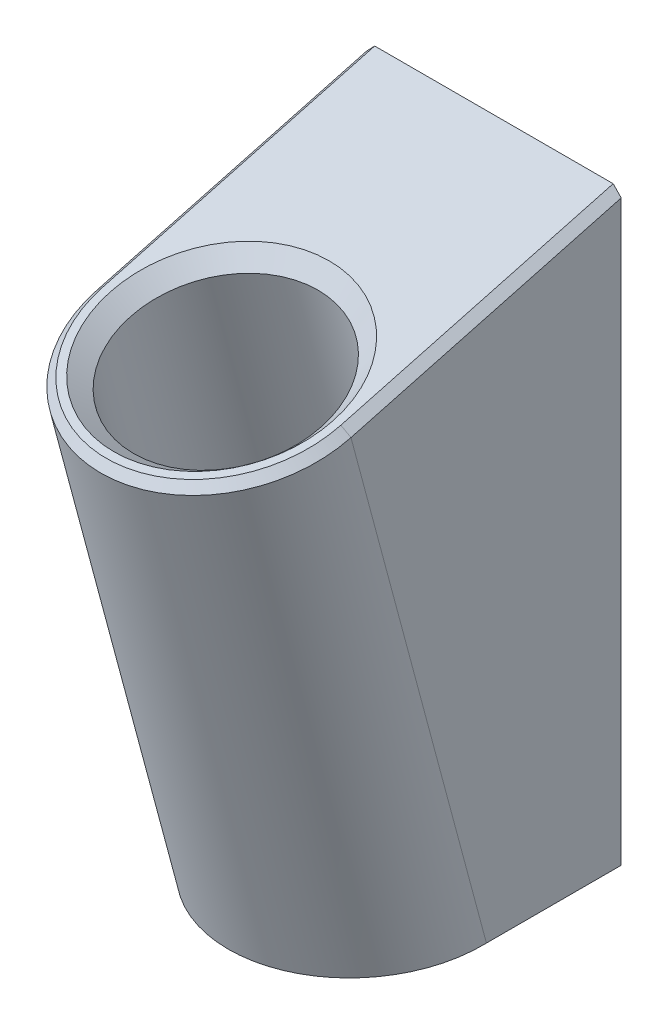
ISO-10303-21;
HEADER;
FILE_DESCRIPTION(('STEP AP214'),'2;1');
FILE_NAME('part.step','',(''),(''),'','','');
FILE_SCHEMA(('AUTOMOTIVE_DESIGN { 1 0 10303 214 1 1 1 1 }'));
ENDSEC;
DATA;
#1=APPLICATION_CONTEXT('core data for automotive mechanical design processes');
#2=APPLICATION_PROTOCOL_DEFINITION('international standard','automotive_design',2000,#1);
#3=PRODUCT_CONTEXT('',#1,'mechanical');
#4=PRODUCT('Part','Part','',(#3));
#5=PRODUCT_RELATED_PRODUCT_CATEGORY('part','',(#4));
#6=PRODUCT_DEFINITION_FORMATION('','',#4);
#7=PRODUCT_DEFINITION_CONTEXT('part definition',#1,'design');
#8=PRODUCT_DEFINITION('design','',#6,#7);
#9=PRODUCT_DEFINITION_SHAPE('','',#8);
#10=(LENGTH_UNIT() NAMED_UNIT(*) SI_UNIT(.MILLI.,.METRE.));
#11=(NAMED_UNIT(*) PLANE_ANGLE_UNIT() SI_UNIT($,.RADIAN.));
#12=(NAMED_UNIT(*) SI_UNIT($,.STERADIAN.) SOLID_ANGLE_UNIT());
#13=UNCERTAINTY_MEASURE_WITH_UNIT(LENGTH_MEASURE(1.E-05),#10,'distance_accuracy_value','');
#14=(GEOMETRIC_REPRESENTATION_CONTEXT(3) GLOBAL_UNCERTAINTY_ASSIGNED_CONTEXT((#13)) GLOBAL_UNIT_ASSIGNED_CONTEXT((#10,
#11,#12)) REPRESENTATION_CONTEXT('',''));
#15=CARTESIAN_POINT('',(0.,0.,0.));
#16=DIRECTION('',(0.,0.,1.));
#17=DIRECTION('',(1.,0.,0.));
#18=AXIS2_PLACEMENT_3D('',#15,#16,#17);
#19=CARTESIAN_POINT('',(0.,49.0690319754847,13.1480074912081));
#20=DIRECTION('',(0.,-0.965925826289068,-0.258819045102521));
#21=DIRECTION('',(0.,0.258819045102521,-0.965925826289068));
#22=AXIS2_PLACEMENT_3D('',#19,#20,#21);
#23=CYLINDRICAL_SURFACE('',#22,12.7);
#24=DIRECTION('',(0.,-0.965925826289068,-0.258819045102522));
#25=VECTOR('',#24,1.);
#26=CARTESIAN_POINT('',(-12.7,-3.28700187280202,-0.880749497336891));
#27=LINE('',#26,#25);
#28=CARTESIAN_POINT('',(-12.7,48.2962913878637,12.9409522747963));
#29=VERTEX_POINT('',#28);
#30=CARTESIAN_POINT('',(-12.7,-2.15563113038379,-0.577599620565727));
#31=VERTEX_POINT('',#30);
#32=EDGE_CURVE('E453',#29,#31,#27,.T.);
#33=ORIENTED_EDGE('',*,*,#32,.T.);
#34=CARTESIAN_POINT('',(12.7,-2.15563113038379,-0.577599620565721));
#35=CARTESIAN_POINT('',(12.7000560014715,-2.17910355031777,0.27665085115123));
#36=CARTESIAN_POINT('',(12.6181355906319,-2.20257499875157,1.13086596628712));
#37=CARTESIAN_POINT('',(12.2938105316101,-2.24861780678423,2.80653854677486));
#38=CARTESIAN_POINT('',(12.0513633068559,-2.27118726056842,3.62792665229435));
#39=CARTESIAN_POINT('',(11.4151768189307,-2.31455863737409,5.20637570865247));
#40=CARTESIAN_POINT('',(11.0214638896937,-2.33535876510674,5.96337132211552));
#41=CARTESIAN_POINT('',(10.0978642627909,-2.37439197299807,7.3839379423253));
#42=CARTESIAN_POINT('',(9.56801579617423,-2.39262343743514,8.04745014683036));
#43=CARTESIAN_POINT('',(8.39249644596408,-2.4258184521228,9.25554275233576));
#44=CARTESIAN_POINT('',(7.74687422142469,-2.44078062831067,9.80007314597828));
#45=CARTESIAN_POINT('',(6.36460969727319,-2.46686178399562,10.749265415435));
#46=CARTESIAN_POINT('',(5.62802461484696,-2.47797968389497,11.1538880005894));
#47=CARTESIAN_POINT('',(4.09213456722628,-2.49594469638986,11.8077030073642));
#48=CARTESIAN_POINT('',(3.29289317854754,-2.5027910653434,12.056868365029));
#49=CARTESIAN_POINT('',(1.6624010006621,-2.51194954929211,12.3901803650444));
#50=CARTESIAN_POINT('',(0.831217704058544,-2.51426128518113,12.4743132102829));
#51=CARTESIAN_POINT('',(-0.831217704058529,-2.51426128518113,12.4743132102829));
#52=CARTESIAN_POINT('',(-1.6624010006621,-2.51194954929212,12.3901803650444));
#53=CARTESIAN_POINT('',(-3.29289317854757,-2.5027910653434,12.0568683650289));
#54=CARTESIAN_POINT('',(-4.09213456722631,-2.49594469638986,11.8077030073642));
#55=CARTESIAN_POINT('',(-5.628024614847,-2.47797968389496,11.1538880005894));
#56=CARTESIAN_POINT('',(-6.36460969727321,-2.46686178399561,10.749265415435));
#57=CARTESIAN_POINT('',(-7.74687422142469,-2.44078062831067,9.80007314597827));
#58=CARTESIAN_POINT('',(-8.39249644596408,-2.42581845212281,9.25554275233577));
#59=CARTESIAN_POINT('',(-9.56801579617421,-2.39262343743516,8.04745014683037));
#60=CARTESIAN_POINT('',(-10.0978642627909,-2.37439197299806,7.3839379423253));
#61=CARTESIAN_POINT('',(-11.0214638896938,-2.33535876510674,5.96337132211549));
#62=CARTESIAN_POINT('',(-11.4151768189307,-2.31455863737409,5.20637570865246));
#63=CARTESIAN_POINT('',(-12.0513633068559,-2.27118726056843,3.62792665229433));
#64=CARTESIAN_POINT('',(-12.2938105316101,-2.24861780678423,2.80653854677483));
#65=CARTESIAN_POINT('',(-12.6181355906319,-2.20257499875156,1.1308659662871));
#66=CARTESIAN_POINT('',(-12.7000560014715,-2.17910355031777,0.276650851151182));
#67=CARTESIAN_POINT('',(-12.7,-2.15563113038379,-0.577599620565723));
#68=B_SPLINE_CURVE_WITH_KNOTS('',3,(#34,#35,#36,#37,#38,#39,#40,#41,#42,#43,#44,#45,#46,#47,#48,
#49,#50,#51,#52,#53,#54,#55,#56,#57,#58,#59,#60,#61,#62,#63,#64,#65,#66,#67),.UNSPECIFIED.,.F.,
.F.,(4,2,2,2,2,2,2,2,2,2,2,2,2,2,2,2,4),(1.5707963267949,1.76714586764426,1.96349540849362,
2.15984494934298,2.35619449019234,2.55254403104171,2.74889357189107,2.94524311274043,
3.14159265358979,3.33794219443916,3.53429173528852,3.73064127613788,3.92699081698724,
4.1233403578366,4.31968989868597,4.51603943953533,4.71238898038469),.UNSPECIFIED.);
#69=CARTESIAN_POINT('',(12.7,-2.15563113039091,-0.577599620567634));
#70=VERTEX_POINT('',#69);
#71=EDGE_CURVE('E130',#31,#70,#68,.F.);
#72=ORIENTED_EDGE('',*,*,#71,.T.);
#73=DIRECTION('',(0.,-0.965925826289068,-0.258819045102522));
#74=VECTOR('',#73,1.);
#75=CARTESIAN_POINT('',(12.7,-3.28700187280202,-0.880749497336891));
#76=LINE('',#75,#74);
#77=CARTESIAN_POINT('',(12.7,48.2962913878637,12.9409522747963));
#78=VERTEX_POINT('',#77);
#79=EDGE_CURVE('E114',#78,#70,#76,.T.);
#80=ORIENTED_EDGE('',*,*,#79,.F.);
#81=CARTESIAN_POINT('',(0.,48.2962913878637,12.9409522747963));
#82=DIRECTION('',(0.,0.965925826289068,0.258819045102521));
#83=DIRECTION('',(0.,-0.258819045102521,0.965925826289068));
#84=AXIS2_PLACEMENT_3D('',#81,#82,#83);
#85=CIRCLE('',#84,12.7);
#86=EDGE_CURVE('E127',#78,#29,#85,.F.);
#87=ORIENTED_EDGE('',*,*,#86,.T.);
#88=EDGE_LOOP('',(#33,#72,#80,#87));
#89=FACE_BOUND('',#88,.T.);
#90=ADVANCED_FACE('F41',(#89),#23,.T.);
#91=CARTESIAN_POINT('',(0.,49.0690319754847,13.1480074912081));
#92=DIRECTION('',(0.,0.965925826289068,0.258819045102521));
#93=DIRECTION('',(0.,-0.258819045102521,0.965925826289068));
#94=AXIS2_PLACEMENT_3D('',#91,#92,#93);
#95=PLANE('',#94);
#96=CARTESIAN_POINT('',(0.,49.0690319754847,13.1480074912081));
#97=DIRECTION('',(0.,0.965925826289068,0.258819045102521));
#98=DIRECTION('',(0.,-0.258819045102521,0.965925826289068));
#99=AXIS2_PLACEMENT_3D('',#96,#97,#98);
#100=CIRCLE('',#99,11.125000102);
#101=CARTESIAN_POINT('',(0.,46.1896700723196,23.8939324071984));
#102=VERTEX_POINT('',#101);
#103=EDGE_CURVE('E50',#102,#102,#100,.F.);
#104=ORIENTED_EDGE('',*,*,#103,.T.);
#105=EDGE_LOOP('',(#104));
#106=FACE_BOUND('',#105,.T.);
#107=DIRECTION('',(-1.,0.,0.));
#108=VECTOR('',#107,1.);
#109=CARTESIAN_POINT('',(12.7,56.3510240707253,-14.0287569885449));
#110=LINE('',#109,#108);
#111=CARTESIAN_POINT('',(11.900000076,56.3510240707253,-14.0287569885449));
#112=VERTEX_POINT('',#111);
#113=CARTESIAN_POINT('',(-11.900000076,56.3510240707253,-14.0287569885449));
#114=VERTEX_POINT('',#113);
#115=EDGE_CURVE('E463',#112,#114,#110,.T.);
#116=ORIENTED_EDGE('',*,*,#115,.T.);
#117=DIRECTION('',(0.,-0.258819045102521,0.965925826289068));
#118=VECTOR('',#117,1.);
#119=CARTESIAN_POINT('',(-11.900000076,49.0690319754847,13.1480074912081));
#120=LINE('',#119,#118);
#121=CARTESIAN_POINT('',(-11.900000076,49.0690319754847,13.1480074912081));
#122=VERTEX_POINT('',#121);
#123=EDGE_CURVE('E485',#114,#122,#120,.T.);
#124=ORIENTED_EDGE('',*,*,#123,.T.);
#125=CARTESIAN_POINT('',(0.,49.0690319754847,13.1480074912081));
#126=DIRECTION('',(0.,0.965925826289068,0.258819045102521));
#127=DIRECTION('',(0.,-0.258819045102521,0.965925826289068));
#128=AXIS2_PLACEMENT_3D('',#125,#126,#127);
#129=CIRCLE('',#128,11.900000076);
#130=CARTESIAN_POINT('',(11.900000076,49.0690319754847,13.1480074912081));
#131=VERTEX_POINT('',#130);
#132=EDGE_CURVE('E57',#122,#131,#129,.T.);
#133=ORIENTED_EDGE('',*,*,#132,.T.);
#134=DIRECTION('',(0.,0.258819045102521,-0.965925826289068));
#135=VECTOR('',#134,1.);
#136=CARTESIAN_POINT('',(11.900000076,56.3510240707253,-14.0287569885449));
#137=LINE('',#136,#135);
#138=EDGE_CURVE('E137',#131,#112,#137,.T.);
#139=ORIENTED_EDGE('',*,*,#138,.T.);
#140=EDGE_LOOP('',(#116,#124,#133,#139));
#141=FACE_BOUND('',#140,.T.);
#142=ADVANCED_FACE('F163',(#106,#141),#95,.T.);
#143=CARTESIAN_POINT('',(0.,-3.28700187280202,0.));
#144=DIRECTION('',(0.,1.,0.));
#145=DIRECTION('',(0.,0.,1.));
#146=AXIS2_PLACEMENT_3D('',#143,#144,#145);
#147=PLANE('',#146);
#148=DIRECTION('',(-1.,0.,0.));
#149=VECTOR('',#148,1.);
#150=CARTESIAN_POINT('',(12.7,-3.28700187280202,-14.0287569885449));
#151=LINE('',#150,#149);
#152=CARTESIAN_POINT('',(11.3143594855808,-3.28700187280202,-14.0287569885449));
#153=VERTEX_POINT('',#152);
#154=CARTESIAN_POINT('',(-11.3143594855808,-3.28700187280202,-14.0287569885449));
#155=VERTEX_POINT('',#154);
#156=EDGE_CURVE('E122',#153,#155,#151,.T.);
#157=ORIENTED_EDGE('',*,*,#156,.F.);
#158=DIRECTION('',(0.,0.,1.));
#159=VECTOR('',#158,1.);
#160=CARTESIAN_POINT('',(11.3143594855808,-3.28700187280202,0.));
#161=LINE('',#160,#159);
#162=CARTESIAN_POINT('',(11.3143594855808,-3.28700187280202,-0.577599620565723));
#163=VERTEX_POINT('',#162);
#164=EDGE_CURVE('E446',#153,#163,#161,.T.);
#165=ORIENTED_EDGE('',*,*,#164,.T.);
#166=CARTESIAN_POINT('',(-11.3143594855808,-3.28700187280202,-0.577599620565726));
#167=CARTESIAN_POINT('',(-11.3144093769808,-3.28700187280202,0.189050587380929));
#168=CARTESIAN_POINT('',(-11.2414269378079,-3.28700187280202,0.955669064455564));
#169=CARTESIAN_POINT('',(-10.9524875434887,-3.28700187280202,2.45950754600059));
#170=CARTESIAN_POINT('',(-10.7364926570888,-3.28700187280202,3.19666530333467));
#171=CARTESIAN_POINT('',(-10.1697176473173,-3.28700187280202,4.61325017782893));
#172=CARTESIAN_POINT('',(-9.81896098466747,-3.28700187280202,5.29261865781325));
#173=CARTESIAN_POINT('',(-8.9961312051875,-3.28700187280202,6.56751136297421));
#174=CARTESIAN_POINT('',(-8.52409214815937,-3.28700187280202,7.16298281591227));
#175=CARTESIAN_POINT('',(-7.47682848591364,-3.28700187280202,8.2471899400443));
#176=CARTESIAN_POINT('',(-6.90164723077698,-3.28700187280202,8.7358807319575));
#177=CARTESIAN_POINT('',(-5.67019544096636,-3.28700187280202,9.58773680328766));
#178=CARTESIAN_POINT('',(-5.01397588080901,-3.28700187280202,9.95086682113265));
#179=CARTESIAN_POINT('',(-3.64565996510015,-3.28700187280202,10.5376354885313));
#180=CARTESIAN_POINT('',(-2.93362024960532,-3.28700187280202,10.7612498494028));
#181=CARTESIAN_POINT('',(-1.48102382129107,-3.28700187280202,11.0603819220105));
#182=CARTESIAN_POINT('',(-0.74052723738689,-3.28700187280202,11.1358872514529));
#183=CARTESIAN_POINT('',(0.740527237386907,-3.28700187280202,11.1358872514529));
#184=CARTESIAN_POINT('',(1.48102382129107,-3.28700187280202,11.0603819220106));
#185=CARTESIAN_POINT('',(2.93362024960529,-3.28700187280202,10.7612498494028));
#186=CARTESIAN_POINT('',(3.64565996510012,-3.28700187280202,10.5376354885313));
#187=CARTESIAN_POINT('',(5.01397588080898,-3.28700187280202,9.95086682113266));
#188=CARTESIAN_POINT('',(5.67019544096633,-3.28700187280202,9.58773680328768));
#189=CARTESIAN_POINT('',(6.90164723077698,-3.28700187280202,8.73588073195751));
#190=CARTESIAN_POINT('',(7.47682848591365,-3.28700187280202,8.24718994004429));
#191=CARTESIAN_POINT('',(8.52409214815938,-3.28700187280202,7.16298281591226));
#192=CARTESIAN_POINT('',(8.99613120518749,-3.28700187280202,6.56751136297422));
#193=CARTESIAN_POINT('',(9.81896098466746,-3.28700187280202,5.29261865781327));
#194=CARTESIAN_POINT('',(10.1697176473173,-3.28700187280202,4.61325017782894));
#195=CARTESIAN_POINT('',(10.7364926570888,-3.28700187280202,3.19666530333468));
#196=CARTESIAN_POINT('',(10.9524875434887,-3.28700187280202,2.45950754600062));
#197=CARTESIAN_POINT('',(11.2414269378079,-3.28700187280202,0.955669064455583));
#198=CARTESIAN_POINT('',(11.3144093769808,-3.28700187280202,0.189050587380972));
#199=CARTESIAN_POINT('',(11.3143594855808,-3.28700187280202,-0.577599620565723));
#200=B_SPLINE_CURVE_WITH_KNOTS('',3,(#166,#167,#168,#169,#170,#171,#172,#173,#174,#175,#176,
#177,#178,#179,#180,#181,#182,#183,#184,#185,#186,#187,#188,#189,#190,#191,#192,#193,#194,#195,
#196,#197,#198,#199),.UNSPECIFIED.,.F.,.F.,(4,2,2,2,2,2,2,2,2,2,2,2,2,2,2,2,4),(1.5707963267949,
1.76714586764426,1.96349540849362,2.15984494934298,2.35619449019234,2.55254403104171,
2.74889357189107,2.94524311274043,3.14159265358979,3.33794219443916,3.53429173528852,
3.73064127613788,3.92699081698724,4.1233403578366,4.31968989868597,4.51603943953533,
4.71238898038469),.UNSPECIFIED.);
#201=CARTESIAN_POINT('',(-11.3143594855808,-3.28700187280202,-0.577599620565726));
#202=VERTEX_POINT('',#201);
#203=EDGE_CURVE('E447',#163,#202,#200,.F.);
#204=ORIENTED_EDGE('',*,*,#203,.T.);
#205=DIRECTION('',(0.,0.,-1.));
#206=VECTOR('',#205,1.);
#207=CARTESIAN_POINT('',(-11.3143594855808,-3.28700187280202,-14.0287569885449));
#208=LINE('',#207,#206);
#209=EDGE_CURVE('E439',#202,#155,#208,.T.);
#210=ORIENTED_EDGE('',*,*,#209,.T.);
#211=EDGE_LOOP('',(#157,#165,#204,#210));
#212=FACE_BOUND('',#211,.T.);
#213=ADVANCED_FACE('F308',(#212),#147,.F.);
#214=CARTESIAN_POINT('',(12.7,56.3510240707253,-14.0287569885449));
#215=DIRECTION('',(0.,0.,1.));
#216=DIRECTION('',(0.,-1.,0.));
#217=AXIS2_PLACEMENT_3D('',#214,#215,#216);
#218=PLANE('',#217);
#219=DIRECTION('',(0.,1.,0.));
#220=VECTOR('',#219,1.);
#221=CARTESIAN_POINT('',(12.7,56.3510240707253,-14.0287569885449));
#222=LINE('',#221,#220);
#223=CARTESIAN_POINT('',(12.7,-2.15563113038379,-14.0287569885449));
#224=VERTEX_POINT('',#223);
#225=CARTESIAN_POINT('',(12.7,55.5228032050782,-14.0287569885449));
#226=VERTEX_POINT('',#225);
#227=EDGE_CURVE('E117',#224,#226,#222,.T.);
#228=ORIENTED_EDGE('',*,*,#227,.F.);
#229=DIRECTION('',(0.774596669241482,0.632455532033677,0.));
#230=VECTOR('',#229,1.);
#231=CARTESIAN_POINT('',(12.7,-2.15563113038379,-14.0287569885449));
#232=LINE('',#231,#230);
#233=EDGE_CURVE('E472',#224,#153,#232,.F.);
#234=ORIENTED_EDGE('',*,*,#233,.T.);
#235=ORIENTED_EDGE('',*,*,#156,.T.);
#236=DIRECTION('',(-0.774596669241482,0.632455532033677,0.));
#237=VECTOR('',#236,1.);
#238=CARTESIAN_POINT('',(-11.3143594855808,-3.28700187280202,-14.0287569885449));
#239=LINE('',#238,#237);
#240=CARTESIAN_POINT('',(-12.7,-2.15563113038379,-14.0287569885449));
#241=VERTEX_POINT('',#240);
#242=EDGE_CURVE('E480',#155,#241,#239,.T.);
#243=ORIENTED_EDGE('',*,*,#242,.T.);
#244=DIRECTION('',(0.,1.,0.));
#245=VECTOR('',#244,1.);
#246=CARTESIAN_POINT('',(-12.7,56.3510240707253,-14.0287569885449));
#247=LINE('',#246,#245);
#248=CARTESIAN_POINT('',(-12.7,55.5228032050782,-14.0287569885449));
#249=VERTEX_POINT('',#248);
#250=EDGE_CURVE('E132',#241,#249,#247,.T.);
#251=ORIENTED_EDGE('',*,*,#250,.T.);
#252=DIRECTION('',(-0.694746590606862,-0.719254596676407,0.));
#253=VECTOR('',#252,1.);
#254=CARTESIAN_POINT('',(-15.538809187156,52.5838516728862,-14.0287569885449));
#255=LINE('',#254,#253);
#256=EDGE_CURVE('E474',#249,#114,#255,.F.);
#257=ORIENTED_EDGE('',*,*,#256,.T.);
#258=ORIENTED_EDGE('',*,*,#115,.F.);
#259=DIRECTION('',(0.694746590606862,-0.719254596676407,0.));
#260=VECTOR('',#259,1.);
#261=CARTESIAN_POINT('',(16.3110856340456,51.7843322627297,-14.0287569885449));
#262=LINE('',#261,#260);
#263=EDGE_CURVE('E473',#112,#226,#262,.T.);
#264=ORIENTED_EDGE('',*,*,#263,.T.);
#265=EDGE_LOOP('',(#228,#234,#235,#243,#251,#257,#258,#264));
#266=FACE_BOUND('',#265,.T.);
#267=ADVANCED_FACE('F370',(#266),#218,.F.);
#268=CARTESIAN_POINT('',(12.7,0.,0.));
#269=DIRECTION('',(-1.,0.,0.));
#270=DIRECTION('',(0.,0.,1.));
#271=AXIS2_PLACEMENT_3D('',#268,#269,#270);
#272=PLANE('',#271);
#273=ORIENTED_EDGE('',*,*,#79,.T.);
#274=DIRECTION('',(0.,0.,-1.));
#275=VECTOR('',#274,1.);
#276=CARTESIAN_POINT('',(12.7,-2.15563113038379,0.));
#277=LINE('',#276,#275);
#278=EDGE_CURVE('E121',#70,#224,#277,.T.);
#279=ORIENTED_EDGE('',*,*,#278,.T.);
#280=ORIENTED_EDGE('',*,*,#227,.T.);
#281=DIRECTION('',(0.,-0.258819045102521,0.965925826289068));
#282=VECTOR('',#281,1.);
#283=CARTESIAN_POINT('',(12.7,48.2962913878637,12.9409522747963));
#284=LINE('',#283,#282);
#285=EDGE_CURVE('E110',#226,#78,#284,.T.);
#286=ORIENTED_EDGE('',*,*,#285,.T.);
#287=EDGE_LOOP('',(#273,#279,#280,#286));
#288=FACE_BOUND('',#287,.T.);
#289=ADVANCED_FACE('F112',(#288),#272,.F.);
#290=CARTESIAN_POINT('',(-12.7,0.,0.));
#291=DIRECTION('',(-1.,0.,0.));
#292=DIRECTION('',(0.,0.,1.));
#293=AXIS2_PLACEMENT_3D('',#290,#291,#292);
#294=PLANE('',#293);
#295=ORIENTED_EDGE('',*,*,#250,.F.);
#296=DIRECTION('',(0.,0.,1.));
#297=VECTOR('',#296,1.);
#298=CARTESIAN_POINT('',(-12.7,-2.15563113038379,-0.880749497336889));
#299=LINE('',#298,#297);
#300=EDGE_CURVE('E142',#241,#31,#299,.T.);
#301=ORIENTED_EDGE('',*,*,#300,.T.);
#302=ORIENTED_EDGE('',*,*,#32,.F.);
#303=DIRECTION('',(0.,0.258819045102521,-0.965925826289068));
#304=VECTOR('',#303,1.);
#305=CARTESIAN_POINT('',(-12.7,48.2962913878637,12.9409522747963));
#306=LINE('',#305,#304);
#307=EDGE_CURVE('E144',#29,#249,#306,.T.);
#308=ORIENTED_EDGE('',*,*,#307,.T.);
#309=EDGE_LOOP('',(#295,#301,#302,#308));
#310=FACE_BOUND('',#309,.T.);
#311=ADVANCED_FACE('F293',(#310),#294,.T.);
#312=CARTESIAN_POINT('',(0.,58.9300375938907,15.7902559832188));
#313=DIRECTION('',(0.,-0.965925826289068,-0.258819045102521));
#314=DIRECTION('',(0.,0.258819045102521,-0.965925826289068));
#315=AXIS2_PLACEMENT_3D('',#312,#313,#314);
#316=CYLINDRICAL_SURFACE('',#315,9.525);
#317=CARTESIAN_POINT('',(0.,47.5235505548977,12.7338969926445));
#318=DIRECTION('',(0.,0.965925826289068,0.258819045102521));
#319=DIRECTION('',(0.,-0.258819045102521,0.965925826289068));
#320=AXIS2_PLACEMENT_3D('',#317,#318,#319);
#321=CIRCLE('',#320,9.525);
#322=CARTESIAN_POINT('',(0.,45.0582991502962,21.9343404880479));
#323=VERTEX_POINT('',#322);
#324=EDGE_CURVE('E11',#323,#323,#321,.T.);
#325=ORIENTED_EDGE('',*,*,#324,.T.);
#326=EDGE_LOOP('',(#325));
#327=FACE_BOUND('',#326,.T.);
#328=CARTESIAN_POINT('',(0.,0.,0.));
#329=DIRECTION('',(0.,0.965925826289068,0.258819045102521));
#330=DIRECTION('',(0.,-0.258819045102521,0.965925826289068));
#331=AXIS2_PLACEMENT_3D('',#328,#329,#330);
#332=CIRCLE('',#331,9.525);
#333=CARTESIAN_POINT('',(0.,-2.46525140460152,9.20044349540337));
#334=VERTEX_POINT('',#333);
#335=EDGE_CURVE('E456',#334,#334,#332,.T.);
#336=ORIENTED_EDGE('',*,*,#335,.F.);
#337=EDGE_LOOP('',(#336));
#338=FACE_BOUND('',#337,.T.);
#339=ADVANCED_FACE('F287',(#327,#338),#316,.F.);
#340=CARTESIAN_POINT('',(0.,0.,0.));
#341=DIRECTION('',(0.,0.965925826289068,0.258819045102521));
#342=DIRECTION('',(0.,-0.258819045102521,0.965925826289068));
#343=AXIS2_PLACEMENT_3D('',#340,#341,#342);
#344=PLANE('',#343);
#345=ORIENTED_EDGE('',*,*,#335,.T.);
#346=EDGE_LOOP('',(#345));
#347=FACE_BOUND('',#346,.T.);
#348=ADVANCED_FACE('F245',(#347),#344,.T.);
#349=CARTESIAN_POINT('',(-11.3143594855808,-3.28700187280202,0.));
#350=DIRECTION('',(-0.632455532033677,-0.774596669241482,0.));
#351=DIRECTION('',(0.,0.,1.));
#352=AXIS2_PLACEMENT_3D('',#349,#350,#351);
#353=PLANE('',#352);
#354=ORIENTED_EDGE('',*,*,#242,.F.);
#355=ORIENTED_EDGE('',*,*,#209,.F.);
#356=CARTESIAN_POINT('',(-12.7,-2.15563113038379,-0.577599620565723));
#357=CARTESIAN_POINT('',(-11.3143594855808,-3.28700187280202,-0.577599620565726));
#358=B_SPLINE_CURVE_WITH_KNOTS('',1,(#356,#357),.UNSPECIFIED.,.F.,.F.,(2,2),(0.,1.),.UNSPECIFIED.);
#359=EDGE_CURVE('E216',#31,#202,#358,.T.);
#360=ORIENTED_EDGE('',*,*,#359,.F.);
#361=ORIENTED_EDGE('',*,*,#300,.F.);
#362=EDGE_LOOP('',(#354,#355,#360,#361));
#363=FACE_BOUND('',#362,.T.);
#364=ADVANCED_FACE('F234',(#363),#353,.T.);
#365=CARTESIAN_POINT('',(-12.7,-2.15563113038379,-0.577599620565723));
#366=CARTESIAN_POINT('',(-12.7000560014715,-2.17910355031777,0.276650851151182));
#367=CARTESIAN_POINT('',(-12.6181355906319,-2.20257499875156,1.1308659662871));
#368=CARTESIAN_POINT('',(-12.2938105316101,-2.24861780678423,2.80653854677483));
#369=CARTESIAN_POINT('',(-12.0513633068559,-2.27118726056843,3.62792665229433));
#370=CARTESIAN_POINT('',(-11.4151768189307,-2.31455863737409,5.20637570865246));
#371=CARTESIAN_POINT('',(-11.0214638896938,-2.33535876510674,5.96337132211549));
#372=CARTESIAN_POINT('',(-10.0978642627909,-2.37439197299806,7.3839379423253));
#373=CARTESIAN_POINT('',(-9.56801579617421,-2.39262343743516,8.04745014683037));
#374=CARTESIAN_POINT('',(-8.39249644596408,-2.42581845212281,9.25554275233577));
#375=CARTESIAN_POINT('',(-7.74687422142469,-2.44078062831067,9.80007314597827));
#376=CARTESIAN_POINT('',(-6.36460969727321,-2.46686178399561,10.749265415435));
#377=CARTESIAN_POINT('',(-5.628024614847,-2.47797968389496,11.1538880005894));
#378=CARTESIAN_POINT('',(-4.09213456722631,-2.49594469638986,11.8077030073642));
#379=CARTESIAN_POINT('',(-3.29289317854757,-2.5027910653434,12.0568683650289));
#380=CARTESIAN_POINT('',(-1.6624010006621,-2.51194954929212,12.3901803650444));
#381=CARTESIAN_POINT('',(-0.831217704058529,-2.51426128518113,12.4743132102829));
#382=CARTESIAN_POINT('',(0.831217704058544,-2.51426128518113,12.4743132102829));
#383=CARTESIAN_POINT('',(1.6624010006621,-2.51194954929211,12.3901803650444));
#384=CARTESIAN_POINT('',(3.29289317854754,-2.5027910653434,12.056868365029));
#385=CARTESIAN_POINT('',(4.09213456722628,-2.49594469638986,11.8077030073642));
#386=CARTESIAN_POINT('',(5.62802461484696,-2.47797968389497,11.1538880005894));
#387=CARTESIAN_POINT('',(6.36460969727319,-2.46686178399562,10.749265415435));
#388=CARTESIAN_POINT('',(7.74687422142469,-2.44078062831067,9.80007314597828));
#389=CARTESIAN_POINT('',(8.39249644596408,-2.4258184521228,9.25554275233576));
#390=CARTESIAN_POINT('',(9.56801579617423,-2.39262343743514,8.04745014683036));
#391=CARTESIAN_POINT('',(10.0978642627909,-2.37439197299807,7.3839379423253));
#392=CARTESIAN_POINT('',(11.0214638896937,-2.33535876510674,5.96337132211552));
#393=CARTESIAN_POINT('',(11.4151768189307,-2.31455863737409,5.20637570865247));
#394=CARTESIAN_POINT('',(12.0513633068559,-2.27118726056842,3.62792665229435));
#395=CARTESIAN_POINT('',(12.2938105316101,-2.24861780678423,2.80653854677486));
#396=CARTESIAN_POINT('',(12.6181355906319,-2.20257499875157,1.13086596628712));
#397=CARTESIAN_POINT('',(12.7000560014715,-2.17910355031777,0.27665085115123));
#398=CARTESIAN_POINT('',(12.7,-2.15563113038379,-0.577599620565721));
#399=CARTESIAN_POINT('',(-11.3143594855808,-3.28700187280202,-0.577599620565726));
#400=CARTESIAN_POINT('',(-11.3144093769808,-3.28700187280202,0.189050587380929));
#401=CARTESIAN_POINT('',(-11.2414269378079,-3.28700187280202,0.955669064455564));
#402=CARTESIAN_POINT('',(-10.9524875434887,-3.28700187280202,2.45950754600059));
#403=CARTESIAN_POINT('',(-10.7364926570888,-3.28700187280202,3.19666530333467));
#404=CARTESIAN_POINT('',(-10.1697176473173,-3.28700187280202,4.61325017782893));
#405=CARTESIAN_POINT('',(-9.81896098466747,-3.28700187280202,5.29261865781325));
#406=CARTESIAN_POINT('',(-8.9961312051875,-3.28700187280202,6.56751136297421));
#407=CARTESIAN_POINT('',(-8.52409214815937,-3.28700187280202,7.16298281591227));
#408=CARTESIAN_POINT('',(-7.47682848591364,-3.28700187280202,8.2471899400443));
#409=CARTESIAN_POINT('',(-6.90164723077698,-3.28700187280202,8.7358807319575));
#410=CARTESIAN_POINT('',(-5.67019544096636,-3.28700187280202,9.58773680328766));
#411=CARTESIAN_POINT('',(-5.01397588080901,-3.28700187280202,9.95086682113265));
#412=CARTESIAN_POINT('',(-3.64565996510015,-3.28700187280202,10.5376354885313));
#413=CARTESIAN_POINT('',(-2.93362024960532,-3.28700187280202,10.7612498494028));
#414=CARTESIAN_POINT('',(-1.48102382129107,-3.28700187280202,11.0603819220105));
#415=CARTESIAN_POINT('',(-0.74052723738689,-3.28700187280202,11.1358872514529));
#416=CARTESIAN_POINT('',(0.740527237386907,-3.28700187280202,11.1358872514529));
#417=CARTESIAN_POINT('',(1.48102382129107,-3.28700187280202,11.0603819220106));
#418=CARTESIAN_POINT('',(2.93362024960529,-3.28700187280202,10.7612498494028));
#419=CARTESIAN_POINT('',(3.64565996510012,-3.28700187280202,10.5376354885313));
#420=CARTESIAN_POINT('',(5.01397588080898,-3.28700187280202,9.95086682113266));
#421=CARTESIAN_POINT('',(5.67019544096633,-3.28700187280202,9.58773680328768));
#422=CARTESIAN_POINT('',(6.90164723077698,-3.28700187280202,8.73588073195751));
#423=CARTESIAN_POINT('',(7.47682848591365,-3.28700187280202,8.24718994004429));
#424=CARTESIAN_POINT('',(8.52409214815938,-3.28700187280202,7.16298281591226));
#425=CARTESIAN_POINT('',(8.99613120518749,-3.28700187280202,6.56751136297422));
#426=CARTESIAN_POINT('',(9.81896098466746,-3.28700187280202,5.29261865781327));
#427=CARTESIAN_POINT('',(10.1697176473173,-3.28700187280202,4.61325017782894));
#428=CARTESIAN_POINT('',(10.7364926570888,-3.28700187280202,3.19666530333468));
#429=CARTESIAN_POINT('',(10.9524875434887,-3.28700187280202,2.45950754600062));
#430=CARTESIAN_POINT('',(11.2414269378079,-3.28700187280202,0.955669064455583));
#431=CARTESIAN_POINT('',(11.3144093769808,-3.28700187280202,0.189050587380972));
#432=CARTESIAN_POINT('',(11.3143594855808,-3.28700187280202,-0.577599620565723));
#433=B_SPLINE_SURFACE_WITH_KNOTS('',1,3,((#365,#366,#367,#368,#369,#370,#371,#372,#373,#374,
#375,#376,#377,#378,#379,#380,#381,#382,#383,#384,#385,#386,#387,#388,#389,#390,#391,#392,#393,
#394,#395,#396,#397,#398),(#399,#400,#401,#402,#403,#404,#405,#406,#407,#408,#409,#410,#411,
#412,#413,#414,#415,#416,#417,#418,#419,#420,#421,#422,#423,#424,#425,#426,#427,#428,#429,#430,
#431,#432)),.UNSPECIFIED.,.F.,.F.,.F.,(2,2),(4,2,2,2,2,2,2,2,2,2,2,2,2,2,2,2,4),(0.,1.),
(1.5707963267949,1.76714586764426,1.96349540849362,2.15984494934298,2.35619449019234,
2.55254403104171,2.74889357189107,2.94524311274043,3.14159265358979,3.33794219443916,
3.53429173528852,3.73064127613788,3.92699081698724,4.1233403578366,4.31968989868597,
4.51603943953533,4.71238898038469),.UNSPECIFIED.);
#434=CARTESIAN_POINT('',(11.3143594855808,-3.28700187280202,-0.577599620565723));
#435=CARTESIAN_POINT('',(12.7,-2.15563113038379,-0.577599620565721));
#436=B_SPLINE_CURVE_WITH_KNOTS('',1,(#434,#435),.UNSPECIFIED.,.F.,.F.,(2,2),(0.,1.),.UNSPECIFIED.);
#437=EDGE_CURVE('E139',#70,#163,#436,.F.);
#438=ORIENTED_EDGE('',*,*,#359,.T.);
#439=ORIENTED_EDGE('',*,*,#203,.F.);
#440=ORIENTED_EDGE('',*,*,#437,.F.);
#441=ORIENTED_EDGE('',*,*,#71,.F.);
#442=EDGE_LOOP('',(#438,#439,#440,#441));
#443=FACE_BOUND('',#442,.T.);
#444=ADVANCED_FACE('F174',(#443),#433,.T.);
#445=CARTESIAN_POINT('',(12.7,-2.15563113038379,0.));
#446=DIRECTION('',(-0.632455532033677,0.774596669241482,0.));
#447=DIRECTION('',(0.,0.,-1.));
#448=AXIS2_PLACEMENT_3D('',#445,#446,#447);
#449=PLANE('',#448);
#450=ORIENTED_EDGE('',*,*,#437,.T.);
#451=ORIENTED_EDGE('',*,*,#164,.F.);
#452=ORIENTED_EDGE('',*,*,#233,.F.);
#453=ORIENTED_EDGE('',*,*,#278,.F.);
#454=EDGE_LOOP('',(#450,#451,#452,#453));
#455=FACE_BOUND('',#454,.T.);
#456=ADVANCED_FACE('F166',(#455),#449,.F.);
#457=CARTESIAN_POINT('',(12.7,48.2962913878637,12.9409522747963));
#458=DIRECTION('',(0.707106781186551,0.683012701892216,0.183012701892219));
#459=DIRECTION('',(0.,0.258819045102521,-0.965925826289068));
#460=AXIS2_PLACEMENT_3D('',#457,#458,#459);
#461=PLANE('',#460);
#462=ORIENTED_EDGE('',*,*,#263,.F.);
#463=ORIENTED_EDGE('',*,*,#138,.F.);
#464=DIRECTION('',(-0.707106781186544,0.683012701892223,0.183012701892221));
#465=VECTOR('',#464,1.);
#466=CARTESIAN_POINT('',(12.7,48.2962913878637,12.9409522747963));
#467=LINE('',#466,#465);
#468=EDGE_CURVE('E135',#78,#131,#467,.T.);
#469=ORIENTED_EDGE('',*,*,#468,.F.);
#470=ORIENTED_EDGE('',*,*,#285,.F.);
#471=EDGE_LOOP('',(#462,#463,#469,#470));
#472=FACE_BOUND('',#471,.T.);
#473=ADVANCED_FACE('F136',(#472),#461,.T.);
#474=CARTESIAN_POINT('',(0.,49.0690319754847,13.1480074912081));
#475=DIRECTION('',(0.,-0.965925826289068,-0.258819045102521));
#476=DIRECTION('',(0.,0.258819045102521,-0.965925826289068));
#477=AXIS2_PLACEMENT_3D('',#474,#475,#476);
#478=CONICAL_SURFACE('',#477,11.900000076,0.785398163397448);
#479=ORIENTED_EDGE('',*,*,#468,.T.);
#480=ORIENTED_EDGE('',*,*,#132,.F.);
#481=DIRECTION('',(0.707106781186547,0.68301270189222,0.183012701892218));
#482=VECTOR('',#481,1.);
#483=CARTESIAN_POINT('',(-12.7,48.2962913878637,12.9409522747963));
#484=LINE('',#483,#482);
#485=EDGE_CURVE('E65',#29,#122,#484,.T.);
#486=ORIENTED_EDGE('',*,*,#485,.F.);
#487=ORIENTED_EDGE('',*,*,#86,.F.);
#488=EDGE_LOOP('',(#479,#480,#486,#487));
#489=FACE_BOUND('',#488,.T.);
#490=ADVANCED_FACE('F141',(#489),#478,.T.);
#491=CARTESIAN_POINT('',(-11.900000076,49.0690319754847,13.1480074912081));
#492=DIRECTION('',(0.707106781186551,-0.683012701892216,-0.183012701892219));
#493=DIRECTION('',(0.,-0.258819045102521,0.965925826289068));
#494=AXIS2_PLACEMENT_3D('',#491,#492,#493);
#495=PLANE('',#494);
#496=ORIENTED_EDGE('',*,*,#256,.F.);
#497=ORIENTED_EDGE('',*,*,#307,.F.);
#498=ORIENTED_EDGE('',*,*,#485,.T.);
#499=ORIENTED_EDGE('',*,*,#123,.F.);
#500=EDGE_LOOP('',(#496,#497,#498,#499));
#501=FACE_BOUND('',#500,.T.);
#502=ADVANCED_FACE('F247',(#501),#495,.F.);
#503=CARTESIAN_POINT('',(0.,49.0690319754847,13.1480074912081));
#504=DIRECTION('',(0.,0.965925826289068,0.258819045102521));
#505=DIRECTION('',(0.,-0.258819045102521,0.965925826289068));
#506=AXIS2_PLACEMENT_3D('',#503,#504,#505);
#507=CONICAL_SURFACE('',#506,11.125000102,0.785398163397446);
#508=ORIENTED_EDGE('',*,*,#324,.F.);
#509=EDGE_LOOP('',(#508));
#510=FACE_BOUND('',#509,.T.);
#511=ORIENTED_EDGE('',*,*,#103,.F.);
#512=EDGE_LOOP('',(#511));
#513=FACE_BOUND('',#512,.T.);
#514=ADVANCED_FACE('F44',(#510,#513),#507,.F.);
#515=CLOSED_SHELL('',(#90,#142,#213,#267,#289,#311,#339,#348,#364,#444,#456,#473,#490,#502,#514));
#516=MANIFOLD_SOLID_BREP('B2',#515);
#517=ADVANCED_BREP_SHAPE_REPRESENTATION('',(#18,#516),#14);
#518=SHAPE_DEFINITION_REPRESENTATION(#9,#517);
ENDSEC;
END-ISO-10303-21;
